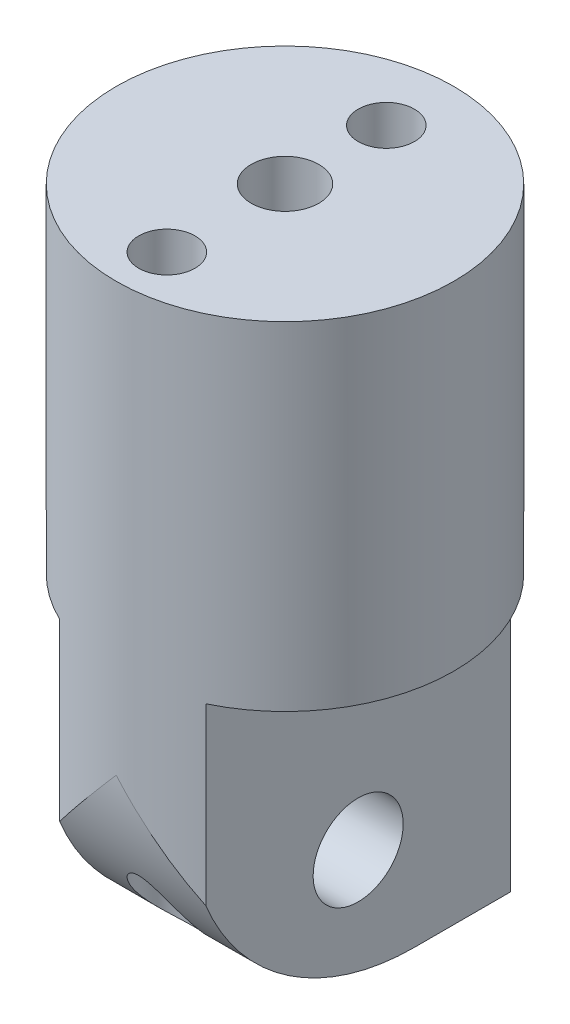
ISO-10303-21;
HEADER;
FILE_DESCRIPTION(('STEP AP214'),'2;1');
FILE_NAME('part.step','',(''),(''),'','','');
FILE_SCHEMA(('AUTOMOTIVE_DESIGN { 1 0 10303 214 1 1 1 1 }'));
ENDSEC;
DATA;
#1=APPLICATION_CONTEXT('core data for automotive mechanical design processes');
#2=APPLICATION_PROTOCOL_DEFINITION('international standard','automotive_design',2000,#1);
#3=PRODUCT_CONTEXT('',#1,'mechanical');
#4=PRODUCT('Part','Part','',(#3));
#5=PRODUCT_RELATED_PRODUCT_CATEGORY('part','',(#4));
#6=PRODUCT_DEFINITION_FORMATION('','',#4);
#7=PRODUCT_DEFINITION_CONTEXT('part definition',#1,'design');
#8=PRODUCT_DEFINITION('design','',#6,#7);
#9=PRODUCT_DEFINITION_SHAPE('','',#8);
#10=(LENGTH_UNIT() NAMED_UNIT(*) SI_UNIT(.MILLI.,.METRE.));
#11=(NAMED_UNIT(*) PLANE_ANGLE_UNIT() SI_UNIT($,.RADIAN.));
#12=(NAMED_UNIT(*) SI_UNIT($,.STERADIAN.) SOLID_ANGLE_UNIT());
#13=UNCERTAINTY_MEASURE_WITH_UNIT(LENGTH_MEASURE(1.E-05),#10,'distance_accuracy_value','');
#14=(GEOMETRIC_REPRESENTATION_CONTEXT(3) GLOBAL_UNCERTAINTY_ASSIGNED_CONTEXT((#13)) GLOBAL_UNIT_ASSIGNED_CONTEXT((#10,
#11,#12)) REPRESENTATION_CONTEXT('',''));
#15=CARTESIAN_POINT('',(0.,0.,0.));
#16=DIRECTION('',(0.,0.,1.));
#17=DIRECTION('',(1.,0.,0.));
#18=AXIS2_PLACEMENT_3D('',#15,#16,#17);
#19=CARTESIAN_POINT('',(3.25,7.,15.));
#20=DIRECTION('',(-1.,0.,0.));
#21=DIRECTION('',(0.,-1.,0.));
#22=AXIS2_PLACEMENT_3D('',#19,#20,#21);
#23=PLANE('',#22);
#24=CARTESIAN_POINT('',(3.25,-2.,7.5));
#25=DIRECTION('',(1.,0.,0.));
#26=DIRECTION('',(0.,1.,0.));
#27=AXIS2_PLACEMENT_3D('',#24,#25,#26);
#28=CIRCLE('',#27,2.);
#29=CARTESIAN_POINT('',(3.25,0.,7.5));
#30=VERTEX_POINT('',#29);
#31=EDGE_CURVE('E151',#30,#30,#28,.T.);
#32=ORIENTED_EDGE('',*,*,#31,.F.);
#33=EDGE_LOOP('',(#32));
#34=FACE_BOUND('',#33,.T.);
#35=DIRECTION('',(0.,1.,0.));
#36=VECTOR('',#35,1.);
#37=CARTESIAN_POINT('',(3.25,-7.,0.740747082702113));
#38=LINE('',#37,#36);
#39=CARTESIAN_POINT('',(3.25,-7.,0.740747082702113));
#40=VERTEX_POINT('',#39);
#41=CARTESIAN_POINT('',(3.25,7.,0.740747082702113));
#42=VERTEX_POINT('',#41);
#43=EDGE_CURVE('E135',#40,#42,#38,.T.);
#44=ORIENTED_EDGE('',*,*,#43,.T.);
#45=DIRECTION('',(0.,0.,-1.));
#46=VECTOR('',#45,1.);
#47=CARTESIAN_POINT('',(3.25,7.,15.));
#48=LINE('',#47,#46);
#49=CARTESIAN_POINT('',(3.25,7.,14.2592529172979));
#50=VERTEX_POINT('',#49);
#51=EDGE_CURVE('E156',#50,#42,#48,.T.);
#52=ORIENTED_EDGE('',*,*,#51,.F.);
#53=DIRECTION('',(0.,1.,0.));
#54=VECTOR('',#53,1.);
#55=CARTESIAN_POINT('',(3.25,-7.,14.2592529172979));
#56=LINE('',#55,#54);
#57=CARTESIAN_POINT('',(3.25,-0.777067038524808,14.2592529172979));
#58=VERTEX_POINT('',#57);
#59=EDGE_CURVE('E90',#58,#50,#56,.T.);
#60=ORIENTED_EDGE('',*,*,#59,.F.);
#61=CARTESIAN_POINT('',(3.25,3.,5.));
#62=DIRECTION('',(-1.,0.,0.));
#63=DIRECTION('',(0.,-1.,0.));
#64=AXIS2_PLACEMENT_3D('',#61,#62,#63);
#65=CIRCLE('',#64,10.);
#66=CARTESIAN_POINT('',(3.25,-7.,5.));
#67=VERTEX_POINT('',#66);
#68=EDGE_CURVE('E145',#58,#67,#65,.F.);
#69=ORIENTED_EDGE('',*,*,#68,.T.);
#70=DIRECTION('',(0.,0.,-1.));
#71=VECTOR('',#70,1.);
#72=CARTESIAN_POINT('',(3.25,-7.,15.));
#73=LINE('',#72,#71);
#74=EDGE_CURVE('E130',#67,#40,#73,.T.);
#75=ORIENTED_EDGE('',*,*,#74,.T.);
#76=EDGE_LOOP('',(#44,#52,#60,#69,#75));
#77=FACE_BOUND('',#76,.T.);
#78=ADVANCED_FACE('F70',(#34,#77),#23,.F.);
#79=CARTESIAN_POINT('',(-3.25,-7.,15.));
#80=DIRECTION('',(0.,1.,0.));
#81=DIRECTION('',(0.,0.,1.));
#82=AXIS2_PLACEMENT_3D('',#79,#80,#81);
#83=PLANE('',#82);
#84=CARTESIAN_POINT('',(0.,-7.,3.));
#85=DIRECTION('',(0.,-1.,0.));
#86=DIRECTION('',(0.,0.,-1.));
#87=AXIS2_PLACEMENT_3D('',#84,#85,#86);
#88=CIRCLE('',#87,1.25);
#89=CARTESIAN_POINT('',(0.,-7.,1.75));
#90=VERTEX_POINT('',#89);
#91=EDGE_CURVE('E219',#90,#90,#88,.T.);
#92=ORIENTED_EDGE('',*,*,#91,.F.);
#93=EDGE_LOOP('',(#92));
#94=FACE_BOUND('',#93,.T.);
#95=CARTESIAN_POINT('',(0.,-7.,7.5));
#96=DIRECTION('',(0.,1.,0.));
#97=DIRECTION('',(0.,0.,1.));
#98=AXIS2_PLACEMENT_3D('',#95,#96,#97);
#99=CIRCLE('',#98,7.5);
#100=CARTESIAN_POINT('',(-3.25,-7.,0.740747082702113));
#101=VERTEX_POINT('',#100);
#102=EDGE_CURVE('E126',#40,#101,#99,.T.);
#103=ORIENTED_EDGE('',*,*,#102,.F.);
#104=ORIENTED_EDGE('',*,*,#74,.F.);
#105=DIRECTION('',(1.,0.,0.));
#106=VECTOR('',#105,1.);
#107=CARTESIAN_POINT('',(-3.25,-7.,5.));
#108=LINE('',#107,#106);
#109=CARTESIAN_POINT('',(-3.25,-7.,5.));
#110=VERTEX_POINT('',#109);
#111=EDGE_CURVE('E159',#67,#110,#108,.F.);
#112=ORIENTED_EDGE('',*,*,#111,.T.);
#113=DIRECTION('',(0.,0.,-1.));
#114=VECTOR('',#113,1.);
#115=CARTESIAN_POINT('',(-3.25,-7.,15.));
#116=LINE('',#115,#114);
#117=EDGE_CURVE('E133',#110,#101,#116,.T.);
#118=ORIENTED_EDGE('',*,*,#117,.T.);
#119=EDGE_LOOP('',(#103,#104,#112,#118));
#120=FACE_BOUND('',#119,.T.);
#121=ADVANCED_FACE('F128',(#94,#120),#83,.F.);
#122=CARTESIAN_POINT('',(-3.25,7.,15.));
#123=DIRECTION('',(1.,0.,0.));
#124=DIRECTION('',(0.,1.,0.));
#125=AXIS2_PLACEMENT_3D('',#122,#123,#124);
#126=PLANE('',#125);
#127=CARTESIAN_POINT('',(-3.25,-2.,7.5));
#128=DIRECTION('',(1.,0.,0.));
#129=DIRECTION('',(0.,1.,0.));
#130=AXIS2_PLACEMENT_3D('',#127,#128,#129);
#131=CIRCLE('',#130,2.);
#132=CARTESIAN_POINT('',(-3.25,0.,7.5));
#133=VERTEX_POINT('',#132);
#134=EDGE_CURVE('E146',#133,#133,#131,.T.);
#135=ORIENTED_EDGE('',*,*,#134,.T.);
#136=EDGE_LOOP('',(#135));
#137=FACE_BOUND('',#136,.T.);
#138=CARTESIAN_POINT('',(-3.25,3.,5.));
#139=DIRECTION('',(1.,0.,0.));
#140=DIRECTION('',(0.,1.,0.));
#141=AXIS2_PLACEMENT_3D('',#138,#139,#140);
#142=CIRCLE('',#141,10.);
#143=CARTESIAN_POINT('',(-3.25,-0.777067038524727,14.2592529172979));
#144=VERTEX_POINT('',#143);
#145=EDGE_CURVE('E83',#110,#144,#142,.F.);
#146=ORIENTED_EDGE('',*,*,#145,.T.);
#147=DIRECTION('',(0.,1.,0.));
#148=VECTOR('',#147,1.);
#149=CARTESIAN_POINT('',(-3.25,-7.,14.2592529172979));
#150=LINE('',#149,#148);
#151=CARTESIAN_POINT('',(-3.25,7.,14.2592529172979));
#152=VERTEX_POINT('',#151);
#153=EDGE_CURVE('E142',#144,#152,#150,.T.);
#154=ORIENTED_EDGE('',*,*,#153,.T.);
#155=DIRECTION('',(0.,0.,-1.));
#156=VECTOR('',#155,1.);
#157=CARTESIAN_POINT('',(-3.25,7.,15.));
#158=LINE('',#157,#156);
#159=CARTESIAN_POINT('',(-3.25,7.,0.740747082702112));
#160=VERTEX_POINT('',#159);
#161=EDGE_CURVE('E148',#152,#160,#158,.T.);
#162=ORIENTED_EDGE('',*,*,#161,.T.);
#163=DIRECTION('',(0.,1.,0.));
#164=VECTOR('',#163,1.);
#165=CARTESIAN_POINT('',(-3.25,-7.,0.740747082702113));
#166=LINE('',#165,#164);
#167=EDGE_CURVE('E97',#101,#160,#166,.T.);
#168=ORIENTED_EDGE('',*,*,#167,.F.);
#169=ORIENTED_EDGE('',*,*,#117,.F.);
#170=EDGE_LOOP('',(#146,#154,#162,#168,#169));
#171=FACE_BOUND('',#170,.T.);
#172=ADVANCED_FACE('F163',(#137,#171),#126,.F.);
#173=CARTESIAN_POINT('',(0.,3.,5.));
#174=DIRECTION('',(-1.,0.,0.));
#175=DIRECTION('',(0.,0.,1.));
#176=AXIS2_PLACEMENT_3D('',#173,#174,#175);
#177=CYLINDRICAL_SURFACE('',#176,10.);
#178=CARTESIAN_POINT('',(0.,-4.60034588039679,11.4988262400479));
#179=CARTESIAN_POINT('',(0.0575288109608131,-4.60034633192946,11.4988256093035));
#180=CARTESIAN_POINT('',(0.11505399772144,-4.59693401826059,11.502822715136));
#181=CARTESIAN_POINT('',(0.22823665096081,-4.5834761227697,11.5185116248287));
#182=CARTESIAN_POINT('',(0.283893883210376,-4.57342971231711,11.5302043899131));
#183=CARTESIAN_POINT('',(0.391522903078539,-4.54727481070758,11.560414189299));
#184=CARTESIAN_POINT('',(0.443509328590721,-4.53119222670741,11.578902052222));
#185=CARTESIAN_POINT('',(0.542970946334787,-4.49367037095389,11.6216094500825));
#186=CARTESIAN_POINT('',(0.590444207603541,-4.47222882047104,11.6458314230352));
#187=CARTESIAN_POINT('',(0.693858382566063,-4.41754856445222,11.7068701017729));
#188=CARTESIAN_POINT('',(0.74800982895763,-4.38270365386441,11.7452795553846));
#189=CARTESIAN_POINT('',(0.847148183723735,-4.30681705487514,11.8274129335695));
#190=CARTESIAN_POINT('',(0.89211987702798,-4.26576527170702,11.8711454925512));
#191=CARTESIAN_POINT('',(0.987252420045894,-4.16367094789748,11.9777470851912));
#192=CARTESIAN_POINT('',(1.03375682534324,-4.10064843319519,12.0419724818224));
#193=CARTESIAN_POINT('',(1.11202550102491,-3.96841120618138,12.1728634669199));
#194=CARTESIAN_POINT('',(1.14376846925352,-3.89918771589937,12.2395324330415));
#195=CARTESIAN_POINT('',(1.20512691121574,-3.72575254744175,12.4015979723462));
#196=CARTESIAN_POINT('',(1.22801220853734,-3.61925054145639,12.4970726247963));
#197=CARTESIAN_POINT('',(1.25192625827192,-3.40072630611675,12.6845018482235));
#198=CARTESIAN_POINT('',(1.25290080853041,-3.28869107409675,12.7764471281507));
#199=CARTESIAN_POINT('',(1.2390160739484,-3.10025953801128,12.9243894094759));
#200=CARTESIAN_POINT('',(1.22941770428853,-3.02467078036612,12.9819973062648));
#201=CARTESIAN_POINT('',(1.20265869273446,-2.87271614168859,13.0944508219831));
#202=CARTESIAN_POINT('',(1.18549447992938,-2.79634991035228,13.1492951229198));
#203=CARTESIAN_POINT('',(1.14397630217485,-2.64352762751517,13.2558626611615));
#204=CARTESIAN_POINT('',(1.1196297934206,-2.56707175066068,13.3075890685247));
#205=CARTESIAN_POINT('',(1.0637867813495,-2.4146576671145,13.4077218470943));
#206=CARTESIAN_POINT('',(1.03229458006037,-2.33869918916016,13.4561301931831));
#207=CARTESIAN_POINT('',(0.959546911817907,-2.18327021358453,13.5523439188718));
#208=CARTESIAN_POINT('',(0.917797461428203,-2.10388405447856,13.5999146411363));
#209=CARTESIAN_POINT('',(0.824662482152894,-1.94813724713139,13.6904545809013));
#210=CARTESIAN_POINT('',(0.773285416874435,-1.87177401232619,13.7334277883316));
#211=CARTESIAN_POINT('',(0.676695759717014,-1.74841146843393,13.8009016608124));
#212=CARTESIAN_POINT('',(0.634678644034613,-1.69976793648386,13.8269441706631));
#213=CARTESIAN_POINT('',(0.543764619578198,-1.60733393640184,13.8755374312719));
#214=CARTESIAN_POINT('',(0.494882481116181,-1.56353340082824,13.8980954657454));
#215=CARTESIAN_POINT('',(0.410328609425263,-1.50057299344001,13.9300362657961));
#216=CARTESIAN_POINT('',(0.377364323238513,-1.47863442485303,13.9410472218018));
#217=CARTESIAN_POINT('',(0.308269866690451,-1.43908401630296,13.9607487164632));
#218=CARTESIAN_POINT('',(0.272144496533989,-1.42146576535685,13.9694426950006));
#219=CARTESIAN_POINT('',(0.204140015054733,-1.39500732552652,13.9824321515032));
#220=CARTESIAN_POINT('',(0.172770922493601,-1.38513258262856,13.9872509335304));
#221=CARTESIAN_POINT('',(0.10863906512088,-1.3702186469195,13.9945127413908));
#222=CARTESIAN_POINT('',(0.0758780804831299,-1.36517346082817,13.9969587118357));
#223=CARTESIAN_POINT('',(0.00971565662024547,-1.36049332526411,13.999228082882));
#224=CARTESIAN_POINT('',(-0.0236880276005255,-1.36088324321488,13.9990394291871));
#225=CARTESIAN_POINT('',(-0.0898697850396133,-1.36708221585887,13.9960326446625));
#226=CARTESIAN_POINT('',(-0.12264736944618,-1.37289534121178,13.9932125386644));
#227=CARTESIAN_POINT('',(-0.192498993484608,-1.39076317365085,13.9845039818664));
#228=CARTESIAN_POINT('',(-0.229268404492208,-1.40376175841571,13.9781502759771));
#229=CARTESIAN_POINT('',(-0.299995279155415,-1.43484740134685,13.9628359879126));
#230=CARTESIAN_POINT('',(-0.333946810007977,-1.45294485968761,13.9538700763329));
#231=CARTESIAN_POINT('',(-0.418925600500643,-1.50503533887645,13.9278178923304));
#232=CARTESIAN_POINT('',(-0.467632638347218,-1.54196424707584,13.909126433341));
#233=CARTESIAN_POINT('',(-0.558564300251688,-1.62136560507975,13.8682014347293));
#234=CARTESIAN_POINT('',(-0.600770050090257,-1.66385355695524,13.8459579501095));
#235=CARTESIAN_POINT('',(-0.678801636651221,-1.75107385940053,13.799413769684));
#236=CARTESIAN_POINT('',(-0.714760353406768,-1.79572378952148,13.7751782289425));
#237=CARTESIAN_POINT('',(-0.782368998157438,-1.88709197799037,13.724624021988));
#238=CARTESIAN_POINT('',(-0.814015009233281,-1.93381206615915,13.6983034959845));
#239=CARTESIAN_POINT('',(-0.873578262146656,-2.02867607236967,13.6438079702081));
#240=CARTESIAN_POINT('',(-0.901487844310031,-2.07682267540891,13.6156293325072));
#241=CARTESIAN_POINT('',(-0.953869165706419,-2.17399414365024,13.5576276254842));
#242=CARTESIAN_POINT('',(-0.978339944562463,-2.22301924990456,13.5278041000089));
#243=CARTESIAN_POINT('',(-1.03648457622005,-2.34837571239289,13.4500224067966));
#244=CARTESIAN_POINT('',(-1.06794492165718,-2.42508593896396,13.4010069487532));
#245=CARTESIAN_POINT('',(-1.12359720816828,-2.57896430130894,13.2996181391025));
#246=CARTESIAN_POINT('',(-1.14778503835172,-2.65613267101885,13.2472429085551));
#247=CARTESIAN_POINT('',(-1.18880186967856,-2.81020378415608,13.1394324196061));
#248=CARTESIAN_POINT('',(-1.2056368062501,-2.8871066919307,13.0839996701717));
#249=CARTESIAN_POINT('',(-1.23159320381571,-3.04008538662955,12.970348311449));
#250=CARTESIAN_POINT('',(-1.2407185329799,-3.11616156941276,12.912131114723));
#251=CARTESIAN_POINT('',(-1.25286792344638,-3.30085753472534,12.766499936122));
#252=CARTESIAN_POINT('',(-1.2513126972625,-3.40875200184953,12.6777134732531));
#253=CARTESIAN_POINT('',(-1.22772366104796,-3.61938148403095,12.4968619169247));
#254=CARTESIAN_POINT('',(-1.20573097558767,-3.72212642360836,12.4048037644697));
#255=CARTESIAN_POINT('',(-1.14743386723128,-3.8900628974733,12.2481774324844));
#256=CARTESIAN_POINT('',(-1.11731814138053,-3.95734634387134,12.1835632594184));
#257=CARTESIAN_POINT('',(-1.04332667285176,-4.0862124112587,12.0564668539613));
#258=CARTESIAN_POINT('',(-0.999468461074937,-4.14780216661484,11.9939820172111));
#259=CARTESIAN_POINT('',(-0.908823343821531,-4.24931724766382,11.8885005866831));
#260=CARTESIAN_POINT('',(-0.865205843162854,-4.2909138401453,11.8444000545688));
#261=CARTESIAN_POINT('',(-0.76883757221327,-4.36814251288804,11.7611894906291));
#262=CARTESIAN_POINT('',(-0.716098431613276,-4.40378207569116,11.7220732130628));
#263=CARTESIAN_POINT('',(-0.612245124736067,-4.46172352984542,11.657643266576));
#264=CARTESIAN_POINT('',(-0.562586109481275,-4.48527243298603,11.6311133106998));
#265=CARTESIAN_POINT('',(-0.458065299417217,-4.52641813587298,11.584375566612));
#266=CARTESIAN_POINT('',(-0.403206475147318,-4.54401830807232,11.5641641967587));
#267=CARTESIAN_POINT('',(-0.291201637526191,-4.57200141151039,11.5318637455773));
#268=CARTESIAN_POINT('',(-0.234168560095787,-4.58257937423715,11.5195555175503));
#269=CARTESIAN_POINT('',(-0.118088610350123,-4.59675024599106,11.5030383998551));
#270=CARTESIAN_POINT('',(-0.0590423964677331,-4.60034541698428,11.4988268873873));
#271=CARTESIAN_POINT('',(0.,-4.60034588039679,11.4988262400479));
#272=B_SPLINE_CURVE_WITH_KNOTS('',3,(#178,#179,#180,#181,#182,#183,#184,#185,#186,#187,#188,
#189,#190,#191,#192,#193,#194,#195,#196,#197,#198,#199,#200,#201,#202,#203,#204,#205,#206,#207,
#208,#209,#210,#211,#212,#213,#214,#215,#216,#217,#218,#219,#220,#221,#222,#223,#224,#225,#226,
#227,#228,#229,#230,#231,#232,#233,#234,#235,#236,#237,#238,#239,#240,#241,#242,#243,#244,#245,
#246,#247,#248,#249,#250,#251,#252,#253,#254,#255,#256,#257,#258,#259,#260,#261,#262,#263,#264,
#265,#266,#267,#268,#269,#270,#271),.UNSPECIFIED.,.T.,.F.,(4,2,2,2,2,2,2,2,2,2,2,2,2,2,2,2,2,2,
2,2,2,2,2,2,2,2,2,2,2,2,2,2,2,2,2,2,2,2,2,2,2,2,2,2,2,2,4),(0.,0.172348273756097,
0.344718078712481,0.516356381687259,0.688067792913604,0.911779782670741,1.13585960792365,
1.43805653794473,1.74068822377861,2.17289589147549,2.60617262432262,2.89241887086686,
3.17880036422053,3.46488559482381,3.75079904413221,4.05491767460736,4.35877019896172,
4.56645367834022,4.77369697735467,4.89669523302743,5.0195098500147,5.11882624455042,
5.21801923115933,5.31766620732977,5.41738803875374,5.53527045520422,5.65339507916606,
5.84407282185146,6.03529410095019,6.22174555510802,6.40836523689131,6.59536181455266,
6.78241051261683,7.07097917352888,7.35971064655029,7.64820861604563,7.93656175026965,
8.35438832069885,8.77137595038052,9.06454630970578,9.35734419210841,9.58060303576063,
9.80357930464446,9.98592361306855,10.1681643728299,10.3451044636672,10.5219872279666),.UNSPECIFIED.);
#273=CARTESIAN_POINT('',(0.,-4.60034588039679,11.4988262400479));
#274=VERTEX_POINT('',#273);
#275=EDGE_CURVE('E217',#274,#274,#272,.T.);
#276=ORIENTED_EDGE('',*,*,#275,.F.);
#277=EDGE_LOOP('',(#276));
#278=FACE_BOUND('',#277,.T.);
#279=CARTESIAN_POINT('',(-3.25,-0.777067038524808,14.2592529172979));
#280=CARTESIAN_POINT('',(-3.11964803441231,-0.623422022657622,14.3219224333858));
#281=CARTESIAN_POINT('',(-2.98826751006328,-0.469006401054278,14.3804577255213));
#282=CARTESIAN_POINT('',(-2.7237404145902,-0.158847919875885,14.4894004376096));
#283=CARTESIAN_POINT('',(-2.59059398915032,-0.00310517016124126,14.539808523586));
#284=CARTESIAN_POINT('',(-2.1888915842863,0.46585242207751,14.6790735815163));
#285=CARTESIAN_POINT('',(-1.91809052694975,0.78077536711749,14.7559627524007));
#286=CARTESIAN_POINT('',(-1.37572389886744,1.4099863558356,14.8779292423823));
#287=CARTESIAN_POINT('',(-1.10419730090432,1.72424533420997,14.9233371711216));
#288=CARTESIAN_POINT('',(-0.5594483269617,2.35399928323636,14.984120133363));
#289=CARTESIAN_POINT('',(-0.286226977240884,2.66949346995055,14.9995118431247));
#290=CARTESIAN_POINT('',(-0.00872869143398145,2.9899209752028,14.9999961890182));
#291=CARTESIAN_POINT('',(-0.00436433249316354,2.9949605028181,14.9999999984407));
#292=CARTESIAN_POINT('',(0.,3.,15.));
#293=B_SPLINE_CURVE_WITH_KNOTS('',3,(#279,#280,#281,#282,#283,#284,#285,#286,#287,#288,#289,
#290,#291,#292),.UNSPECIFIED.,.F.,.F.,(4,2,2,2,2,2,4),(0.,0.632933239584302,1.26581458397719,
2.53166454368447,3.78401078214235,5.03566104994836,5.05566105321367),.UNSPECIFIED.);
#294=CARTESIAN_POINT('',(0.,3.,15.));
#295=VERTEX_POINT('',#294);
#296=EDGE_CURVE('E141',#144,#295,#293,.T.);
#297=ORIENTED_EDGE('',*,*,#296,.F.);
#298=ORIENTED_EDGE('',*,*,#145,.F.);
#299=ORIENTED_EDGE('',*,*,#111,.F.);
#300=ORIENTED_EDGE('',*,*,#68,.F.);
#301=CARTESIAN_POINT('',(3.25,-0.777067038524808,14.2592529172979));
#302=CARTESIAN_POINT('',(3.11964803441233,-0.623422022657608,14.3219224333858));
#303=CARTESIAN_POINT('',(2.9882675100633,-0.469006401054276,14.3804577255213));
#304=CARTESIAN_POINT('',(2.7237404145902,-0.158847919875907,14.4894004376096));
#305=CARTESIAN_POINT('',(2.59059398915031,-0.00310517016127368,14.539808523586));
#306=CARTESIAN_POINT('',(2.18889158428635,0.465852422077542,14.6790735815163));
#307=CARTESIAN_POINT('',(1.91809052694998,0.780775367117685,14.7559627524007));
#308=CARTESIAN_POINT('',(1.37572389886721,1.40998635583541,14.8779292423823));
#309=CARTESIAN_POINT('',(1.10419730090346,1.72424533420923,14.9233371711216));
#310=CARTESIAN_POINT('',(0.559448326962563,2.35399928323711,14.984120133363));
#311=CARTESIAN_POINT('',(0.286226977244101,2.66949346995334,14.9995118431247));
#312=CARTESIAN_POINT('',(0.00872869143408389,2.98992097520289,14.9999961890182));
#313=CARTESIAN_POINT('',(0.00436433249321547,2.99496050281815,14.9999999984407));
#314=CARTESIAN_POINT('',(0.,3.,15.));
#315=B_SPLINE_CURVE_WITH_KNOTS('',3,(#301,#302,#303,#304,#305,#306,#307,#308,#309,#310,#311,
#312,#313,#314),.UNSPECIFIED.,.F.,.F.,(4,2,2,2,2,2,4),(0.,0.632933239584291,1.26581458397717,
2.53166454368448,3.78401078214236,5.03566104994837,5.05566105321368),.UNSPECIFIED.);
#316=EDGE_CURVE('E12',#58,#295,#315,.T.);
#317=ORIENTED_EDGE('',*,*,#316,.T.);
#318=EDGE_LOOP('',(#297,#298,#299,#300,#317));
#319=FACE_BOUND('',#318,.T.);
#320=ADVANCED_FACE('F72',(#278,#319),#177,.T.);
#321=CARTESIAN_POINT('',(-3.25,-2.,7.5));
#322=DIRECTION('',(1.,0.,0.));
#323=DIRECTION('',(0.,1.,0.));
#324=AXIS2_PLACEMENT_3D('',#321,#322,#323);
#325=CYLINDRICAL_SURFACE('',#324,2.);
#326=ORIENTED_EDGE('',*,*,#134,.F.);
#327=EDGE_LOOP('',(#326));
#328=FACE_BOUND('',#327,.T.);
#329=ORIENTED_EDGE('',*,*,#31,.T.);
#330=EDGE_LOOP('',(#329));
#331=FACE_BOUND('',#330,.T.);
#332=ADVANCED_FACE('F193',(#328,#331),#325,.F.);
#333=CARTESIAN_POINT('',(0.,7.,7.5));
#334=DIRECTION('',(0.,1.,0.));
#335=DIRECTION('',(0.,0.,1.));
#336=AXIS2_PLACEMENT_3D('',#333,#334,#335);
#337=PLANE('',#336);
#338=CARTESIAN_POINT('',(0.,7.,7.5));
#339=DIRECTION('',(0.,1.,0.));
#340=DIRECTION('',(0.,0.,1.));
#341=AXIS2_PLACEMENT_3D('',#338,#339,#340);
#342=CIRCLE('',#341,7.5);
#343=EDGE_CURVE('E138',#50,#42,#342,.T.);
#344=ORIENTED_EDGE('',*,*,#343,.F.);
#345=ORIENTED_EDGE('',*,*,#51,.T.);
#346=EDGE_LOOP('',(#344,#345));
#347=FACE_BOUND('',#346,.T.);
#348=ADVANCED_FACE('F189',(#347),#337,.F.);
#349=CARTESIAN_POINT('',(0.,22.,7.5));
#350=DIRECTION('',(0.,-1.,0.));
#351=DIRECTION('',(0.,0.,-1.));
#352=AXIS2_PLACEMENT_3D('',#349,#350,#351);
#353=CYLINDRICAL_SURFACE('',#352,7.5);
#354=CARTESIAN_POINT('',(0.,22.,7.5));
#355=DIRECTION('',(0.,1.,0.));
#356=DIRECTION('',(0.,0.,1.));
#357=AXIS2_PLACEMENT_3D('',#354,#355,#356);
#358=CIRCLE('',#357,7.5);
#359=CARTESIAN_POINT('',(0.,22.,15.));
#360=VERTEX_POINT('',#359);
#361=EDGE_CURVE('E209',#360,#360,#358,.T.);
#362=ORIENTED_EDGE('',*,*,#361,.F.);
#363=EDGE_LOOP('',(#362));
#364=FACE_BOUND('',#363,.T.);
#365=EDGE_CURVE('E214',#160,#152,#342,.T.);
#366=ORIENTED_EDGE('',*,*,#365,.T.);
#367=ORIENTED_EDGE('',*,*,#153,.F.);
#368=ORIENTED_EDGE('',*,*,#296,.T.);
#369=ORIENTED_EDGE('',*,*,#316,.F.);
#370=ORIENTED_EDGE('',*,*,#59,.T.);
#371=ORIENTED_EDGE('',*,*,#343,.T.);
#372=ORIENTED_EDGE('',*,*,#43,.F.);
#373=ORIENTED_EDGE('',*,*,#102,.T.);
#374=ORIENTED_EDGE('',*,*,#167,.T.);
#375=EDGE_LOOP('',(#366,#367,#368,#369,#370,#371,#372,#373,#374));
#376=FACE_BOUND('',#375,.T.);
#377=ADVANCED_FACE('F136',(#364,#376),#353,.T.);
#378=CARTESIAN_POINT('',(0.,22.,7.5));
#379=DIRECTION('',(0.,1.,0.));
#380=DIRECTION('',(0.,0.,1.));
#381=AXIS2_PLACEMENT_3D('',#378,#379,#380);
#382=PLANE('',#381);
#383=CARTESIAN_POINT('',(0.,22.,7.5));
#384=DIRECTION('',(0.,1.,0.));
#385=DIRECTION('',(0.,0.,1.));
#386=AXIS2_PLACEMENT_3D('',#383,#384,#385);
#387=CIRCLE('',#386,1.5);
#388=CARTESIAN_POINT('',(0.,22.,9.));
#389=VERTEX_POINT('',#388);
#390=EDGE_CURVE('E246',#389,#389,#387,.T.);
#391=ORIENTED_EDGE('',*,*,#390,.F.);
#392=EDGE_LOOP('',(#391));
#393=FACE_BOUND('',#392,.T.);
#394=ORIENTED_EDGE('',*,*,#361,.T.);
#395=EDGE_LOOP('',(#394));
#396=FACE_BOUND('',#395,.T.);
#397=CARTESIAN_POINT('',(0.,22.,12.7488262400479));
#398=DIRECTION('',(0.,1.,0.));
#399=DIRECTION('',(0.,0.,1.));
#400=AXIS2_PLACEMENT_3D('',#397,#398,#399);
#401=CIRCLE('',#400,1.25);
#402=CARTESIAN_POINT('',(0.,22.,13.9988262400479));
#403=VERTEX_POINT('',#402);
#404=EDGE_CURVE('E245',#403,#403,#401,.T.);
#405=ORIENTED_EDGE('',*,*,#404,.F.);
#406=EDGE_LOOP('',(#405));
#407=FACE_BOUND('',#406,.T.);
#408=CARTESIAN_POINT('',(0.,22.,3.));
#409=DIRECTION('',(0.,1.,0.));
#410=DIRECTION('',(0.,0.,1.));
#411=AXIS2_PLACEMENT_3D('',#408,#409,#410);
#412=CIRCLE('',#411,1.25);
#413=CARTESIAN_POINT('',(0.,22.,4.25));
#414=VERTEX_POINT('',#413);
#415=EDGE_CURVE('E224',#414,#414,#412,.T.);
#416=ORIENTED_EDGE('',*,*,#415,.F.);
#417=EDGE_LOOP('',(#416));
#418=FACE_BOUND('',#417,.T.);
#419=ADVANCED_FACE('F181',(#393,#396,#407,#418),#382,.T.);
#420=ORIENTED_EDGE('',*,*,#161,.F.);
#421=ORIENTED_EDGE('',*,*,#365,.F.);
#422=EDGE_LOOP('',(#420,#421));
#423=FACE_BOUND('',#422,.T.);
#424=ADVANCED_FACE('F184',(#423),#337,.F.);
#425=CARTESIAN_POINT('',(0.,17.,3.));
#426=DIRECTION('',(0.,-1.,0.));
#427=DIRECTION('',(0.,0.,-1.));
#428=AXIS2_PLACEMENT_3D('',#425,#426,#427);
#429=CYLINDRICAL_SURFACE('',#428,1.25);
#430=ORIENTED_EDGE('',*,*,#91,.T.);
#431=EDGE_LOOP('',(#430));
#432=FACE_BOUND('',#431,.T.);
#433=ORIENTED_EDGE('',*,*,#415,.T.);
#434=EDGE_LOOP('',(#433));
#435=FACE_BOUND('',#434,.T.);
#436=ADVANCED_FACE('F177',(#432,#435),#429,.F.);
#437=CARTESIAN_POINT('',(0.,17.,12.7488262400479));
#438=DIRECTION('',(0.,-1.,0.));
#439=DIRECTION('',(0.,0.,-1.));
#440=AXIS2_PLACEMENT_3D('',#437,#438,#439);
#441=CYLINDRICAL_SURFACE('',#440,1.25);
#442=ORIENTED_EDGE('',*,*,#275,.T.);
#443=EDGE_LOOP('',(#442));
#444=FACE_BOUND('',#443,.T.);
#445=ORIENTED_EDGE('',*,*,#404,.T.);
#446=EDGE_LOOP('',(#445));
#447=FACE_BOUND('',#446,.T.);
#448=ADVANCED_FACE('F229',(#444,#447),#441,.F.);
#449=CARTESIAN_POINT('',(0.,16.,7.5));
#450=DIRECTION('',(0.,1.,0.));
#451=DIRECTION('',(0.,0.,1.));
#452=AXIS2_PLACEMENT_3D('',#449,#450,#451);
#453=CYLINDRICAL_SURFACE('',#452,1.5);
#454=CARTESIAN_POINT('',(0.,16.,7.5));
#455=DIRECTION('',(0.,1.,0.));
#456=DIRECTION('',(0.,0.,1.));
#457=AXIS2_PLACEMENT_3D('',#454,#455,#456);
#458=CIRCLE('',#457,1.5);
#459=CARTESIAN_POINT('',(0.,16.,9.));
#460=VERTEX_POINT('',#459);
#461=EDGE_CURVE('E244',#460,#460,#458,.T.);
#462=ORIENTED_EDGE('',*,*,#461,.F.);
#463=EDGE_LOOP('',(#462));
#464=FACE_BOUND('',#463,.T.);
#465=ORIENTED_EDGE('',*,*,#390,.T.);
#466=EDGE_LOOP('',(#465));
#467=FACE_BOUND('',#466,.T.);
#468=ADVANCED_FACE('F233',(#464,#467),#453,.F.);
#469=CARTESIAN_POINT('',(0.,16.,7.5));
#470=DIRECTION('',(0.,1.,0.));
#471=DIRECTION('',(0.,0.,1.));
#472=AXIS2_PLACEMENT_3D('',#469,#470,#471);
#473=PLANE('',#472);
#474=ORIENTED_EDGE('',*,*,#461,.T.);
#475=EDGE_LOOP('',(#474));
#476=FACE_BOUND('',#475,.T.);
#477=ADVANCED_FACE('F236',(#476),#473,.T.);
#478=CLOSED_SHELL('',(#78,#121,#172,#320,#332,#348,#377,#419,#424,#436,#448,#468,#477));
#479=MANIFOLD_SOLID_BREP('B2',#478);
#480=ADVANCED_BREP_SHAPE_REPRESENTATION('',(#18,#479),#14);
#481=SHAPE_DEFINITION_REPRESENTATION(#9,#480);
ENDSEC;
END-ISO-10303-21;
